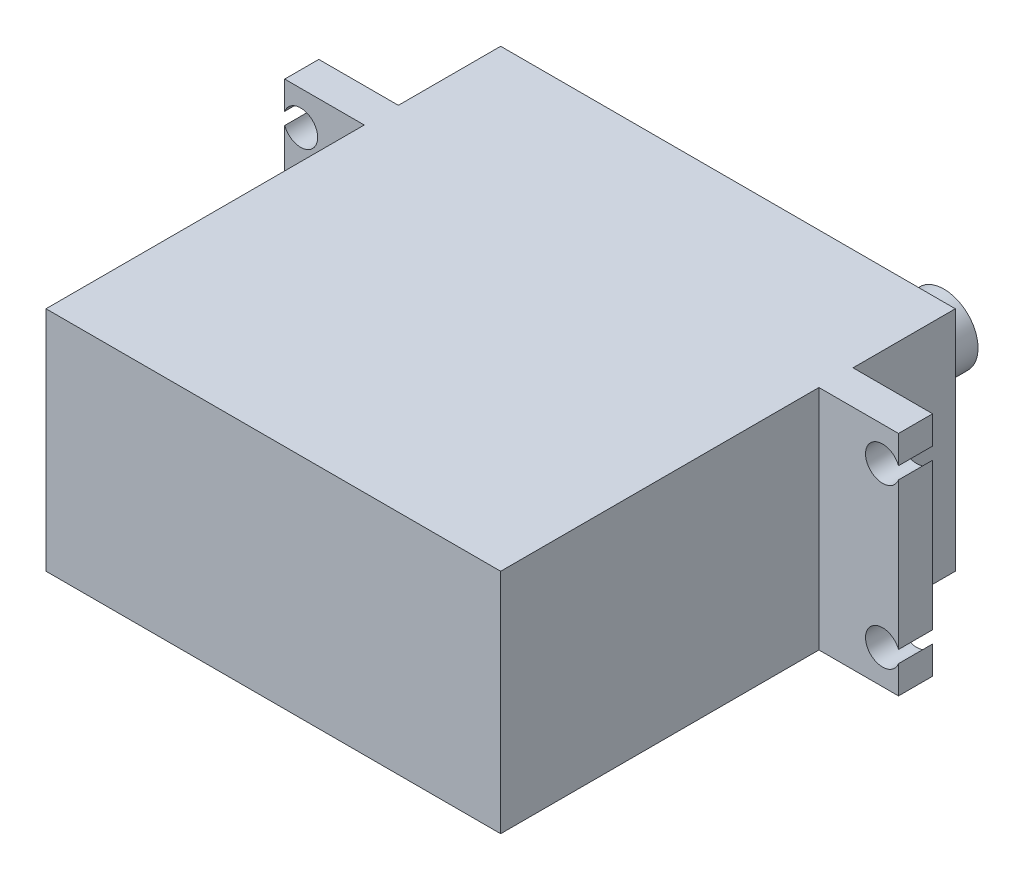
ISO-10303-21;
HEADER;
FILE_DESCRIPTION(('STEP AP214'),'2;1');
FILE_NAME('part.step','',(''),(''),'','','');
FILE_SCHEMA(('AUTOMOTIVE_DESIGN { 1 0 10303 214 1 1 1 1 }'));
ENDSEC;
DATA;
#1=APPLICATION_CONTEXT('core data for automotive mechanical design processes');
#2=APPLICATION_PROTOCOL_DEFINITION('international standard','automotive_design',2000,#1);
#3=PRODUCT_CONTEXT('',#1,'mechanical');
#4=PRODUCT('Part','Part','',(#3));
#5=PRODUCT_RELATED_PRODUCT_CATEGORY('part','',(#4));
#6=PRODUCT_DEFINITION_FORMATION('','',#4);
#7=PRODUCT_DEFINITION_CONTEXT('part definition',#1,'design');
#8=PRODUCT_DEFINITION('design','',#6,#7);
#9=PRODUCT_DEFINITION_SHAPE('','',#8);
#10=(LENGTH_UNIT() NAMED_UNIT(*) SI_UNIT(.MILLI.,.METRE.));
#11=(NAMED_UNIT(*) PLANE_ANGLE_UNIT() SI_UNIT($,.RADIAN.));
#12=(NAMED_UNIT(*) SI_UNIT($,.STERADIAN.) SOLID_ANGLE_UNIT());
#13=UNCERTAINTY_MEASURE_WITH_UNIT(LENGTH_MEASURE(1.E-05),#10,'distance_accuracy_value','');
#14=(GEOMETRIC_REPRESENTATION_CONTEXT(3) GLOBAL_UNCERTAINTY_ASSIGNED_CONTEXT((#13)) GLOBAL_UNIT_ASSIGNED_CONTEXT((#10,
#11,#12)) REPRESENTATION_CONTEXT('',''));
#15=CARTESIAN_POINT('',(0.,0.,0.));
#16=DIRECTION('',(0.,0.,1.));
#17=DIRECTION('',(1.,0.,0.));
#18=AXIS2_PLACEMENT_3D('',#15,#16,#17);
#19=CARTESIAN_POINT('',(47.,0.,0.));
#20=DIRECTION('',(-1.,0.,0.));
#21=DIRECTION('',(0.,0.,1.));
#22=AXIS2_PLACEMENT_3D('',#19,#20,#21);
#23=PLANE('',#22);
#24=DIRECTION('',(0.,-1.,0.));
#25=VECTOR('',#24,1.);
#26=CARTESIAN_POINT('',(47.,20.,12.));
#27=LINE('',#26,#25);
#28=CARTESIAN_POINT('',(47.,16.4614835192865,12.));
#29=VERTEX_POINT('',#28);
#30=CARTESIAN_POINT('',(47.,3.53851648071347,12.));
#31=VERTEX_POINT('',#30);
#32=EDGE_CURVE('E241',#29,#31,#27,.T.);
#33=ORIENTED_EDGE('',*,*,#32,.T.);
#34=DIRECTION('',(0.,0.,-1.));
#35=VECTOR('',#34,1.);
#36=CARTESIAN_POINT('',(47.,3.53851648071347,16.));
#37=LINE('',#36,#35);
#38=CARTESIAN_POINT('',(47.,3.53851648071347,9.));
#39=VERTEX_POINT('',#38);
#40=EDGE_CURVE('E11',#31,#39,#37,.T.);
#41=ORIENTED_EDGE('',*,*,#40,.T.);
#42=DIRECTION('',(0.,1.,0.));
#43=VECTOR('',#42,1.);
#44=CARTESIAN_POINT('',(47.,20.,9.));
#45=LINE('',#44,#43);
#46=CARTESIAN_POINT('',(47.,16.4614835192865,9.));
#47=VERTEX_POINT('',#46);
#48=EDGE_CURVE('E233',#39,#47,#45,.T.);
#49=ORIENTED_EDGE('',*,*,#48,.T.);
#50=DIRECTION('',(0.,0.,-1.));
#51=VECTOR('',#50,1.);
#52=CARTESIAN_POINT('',(47.,16.4614835192865,16.));
#53=LINE('',#52,#51);
#54=EDGE_CURVE('E295',#47,#29,#53,.F.);
#55=ORIENTED_EDGE('',*,*,#54,.T.);
#56=EDGE_LOOP('',(#33,#41,#49,#55));
#57=FACE_BOUND('',#56,.T.);
#58=ADVANCED_FACE('F35',(#57),#23,.F.);
#59=CARTESIAN_POINT('',(-7.,0.,0.));
#60=DIRECTION('',(-1.,0.,0.));
#61=DIRECTION('',(0.,0.,1.));
#62=AXIS2_PLACEMENT_3D('',#59,#60,#61);
#63=PLANE('',#62);
#64=DIRECTION('',(0.,0.,-1.));
#65=VECTOR('',#64,1.);
#66=CARTESIAN_POINT('',(-7.,17.5385164807135,16.));
#67=LINE('',#66,#65);
#68=CARTESIAN_POINT('',(-7.,17.5385164807135,12.));
#69=VERTEX_POINT('',#68);
#70=CARTESIAN_POINT('',(-7.,17.5385164807135,9.));
#71=VERTEX_POINT('',#70);
#72=EDGE_CURVE('E303',#69,#71,#67,.T.);
#73=ORIENTED_EDGE('',*,*,#72,.F.);
#74=DIRECTION('',(0.,1.,0.));
#75=VECTOR('',#74,1.);
#76=CARTESIAN_POINT('',(-7.,20.,12.));
#77=LINE('',#76,#75);
#78=CARTESIAN_POINT('',(-7.,20.,12.));
#79=VERTEX_POINT('',#78);
#80=EDGE_CURVE('E204',#69,#79,#77,.T.);
#81=ORIENTED_EDGE('',*,*,#80,.T.);
#82=DIRECTION('',(0.,0.,-1.));
#83=VECTOR('',#82,1.);
#84=CARTESIAN_POINT('',(-7.,20.,9.));
#85=LINE('',#84,#83);
#86=CARTESIAN_POINT('',(-7.,20.,9.));
#87=VERTEX_POINT('',#86);
#88=EDGE_CURVE('E208',#79,#87,#85,.T.);
#89=ORIENTED_EDGE('',*,*,#88,.T.);
#90=DIRECTION('',(0.,-1.,0.));
#91=VECTOR('',#90,1.);
#92=CARTESIAN_POINT('',(-7.,20.,9.));
#93=LINE('',#92,#91);
#94=EDGE_CURVE('E194',#87,#71,#93,.T.);
#95=ORIENTED_EDGE('',*,*,#94,.T.);
#96=EDGE_LOOP('',(#73,#81,#89,#95));
#97=FACE_BOUND('',#96,.T.);
#98=ADVANCED_FACE('F369',(#97),#63,.T.);
#99=DIRECTION('',(0.,0.,-1.));
#100=VECTOR('',#99,1.);
#101=CARTESIAN_POINT('',(-7.,16.4614835192865,16.));
#102=LINE('',#101,#100);
#103=CARTESIAN_POINT('',(-7.,16.4614835192865,9.));
#104=VERTEX_POINT('',#103);
#105=CARTESIAN_POINT('',(-7.,16.4614835192865,12.));
#106=VERTEX_POINT('',#105);
#107=EDGE_CURVE('E178',#104,#106,#102,.F.);
#108=ORIENTED_EDGE('',*,*,#107,.F.);
#109=CARTESIAN_POINT('',(-7.,3.53851648071344,9.));
#110=VERTEX_POINT('',#109);
#111=EDGE_CURVE('E186',#104,#110,#93,.T.);
#112=ORIENTED_EDGE('',*,*,#111,.T.);
#113=DIRECTION('',(0.,0.,-1.));
#114=VECTOR('',#113,1.);
#115=CARTESIAN_POINT('',(-7.,3.53851648071344,16.));
#116=LINE('',#115,#114);
#117=CARTESIAN_POINT('',(-7.,3.53851648071344,12.));
#118=VERTEX_POINT('',#117);
#119=EDGE_CURVE('E170',#118,#110,#116,.T.);
#120=ORIENTED_EDGE('',*,*,#119,.F.);
#121=EDGE_CURVE('E209',#118,#106,#77,.T.);
#122=ORIENTED_EDGE('',*,*,#121,.T.);
#123=EDGE_LOOP('',(#108,#112,#120,#122));
#124=FACE_BOUND('',#123,.T.);
#125=ADVANCED_FACE('F193',(#124),#63,.T.);
#126=CARTESIAN_POINT('',(47.,20.,12.));
#127=VERTEX_POINT('',#126);
#128=CARTESIAN_POINT('',(47.,17.5385164807135,12.));
#129=VERTEX_POINT('',#128);
#130=EDGE_CURVE('E237',#127,#129,#27,.T.);
#131=ORIENTED_EDGE('',*,*,#130,.T.);
#132=DIRECTION('',(0.,0.,-1.));
#133=VECTOR('',#132,1.);
#134=CARTESIAN_POINT('',(47.,17.5385164807135,16.));
#135=LINE('',#134,#133);
#136=CARTESIAN_POINT('',(47.,17.5385164807135,9.));
#137=VERTEX_POINT('',#136);
#138=EDGE_CURVE('E298',#129,#137,#135,.T.);
#139=ORIENTED_EDGE('',*,*,#138,.T.);
#140=CARTESIAN_POINT('',(47.,20.,9.));
#141=VERTEX_POINT('',#140);
#142=EDGE_CURVE('E234',#137,#141,#45,.T.);
#143=ORIENTED_EDGE('',*,*,#142,.T.);
#144=DIRECTION('',(0.,0.,1.));
#145=VECTOR('',#144,1.);
#146=CARTESIAN_POINT('',(47.,20.,9.));
#147=LINE('',#146,#145);
#148=EDGE_CURVE('E232',#141,#127,#147,.T.);
#149=ORIENTED_EDGE('',*,*,#148,.T.);
#150=EDGE_LOOP('',(#131,#139,#143,#149));
#151=FACE_BOUND('',#150,.T.);
#152=ADVANCED_FACE('F323',(#151),#23,.F.);
#153=CARTESIAN_POINT('',(0.,0.,40.));
#154=DIRECTION('',(1.,0.,0.));
#155=DIRECTION('',(0.,0.,-1.));
#156=AXIS2_PLACEMENT_3D('',#153,#154,#155);
#157=PLANE('',#156);
#158=DIRECTION('',(0.,-1.,0.));
#159=VECTOR('',#158,1.);
#160=CARTESIAN_POINT('',(0.,20.,9.));
#161=LINE('',#160,#159);
#162=CARTESIAN_POINT('',(0.,20.,9.));
#163=VERTEX_POINT('',#162);
#164=CARTESIAN_POINT('',(0.,0.,9.));
#165=VERTEX_POINT('',#164);
#166=EDGE_CURVE('E212',#163,#165,#161,.T.);
#167=ORIENTED_EDGE('',*,*,#166,.F.);
#168=DIRECTION('',(0.,0.,-1.));
#169=VECTOR('',#168,1.);
#170=CARTESIAN_POINT('',(0.,20.,40.));
#171=LINE('',#170,#169);
#172=CARTESIAN_POINT('',(0.,20.,0.));
#173=VERTEX_POINT('',#172);
#174=EDGE_CURVE('E271',#163,#173,#171,.T.);
#175=ORIENTED_EDGE('',*,*,#174,.T.);
#176=DIRECTION('',(0.,-1.,0.));
#177=VECTOR('',#176,1.);
#178=CARTESIAN_POINT('',(0.,0.,0.));
#179=LINE('',#178,#177);
#180=CARTESIAN_POINT('',(0.,0.,0.));
#181=VERTEX_POINT('',#180);
#182=EDGE_CURVE('E260',#173,#181,#179,.T.);
#183=ORIENTED_EDGE('',*,*,#182,.T.);
#184=DIRECTION('',(0.,0.,-1.));
#185=VECTOR('',#184,1.);
#186=CARTESIAN_POINT('',(0.,0.,40.));
#187=LINE('',#186,#185);
#188=EDGE_CURVE('E291',#165,#181,#187,.T.);
#189=ORIENTED_EDGE('',*,*,#188,.F.);
#190=EDGE_LOOP('',(#167,#175,#183,#189));
#191=FACE_BOUND('',#190,.T.);
#192=ADVANCED_FACE('F37',(#191),#157,.F.);
#193=DIRECTION('',(0.,1.,0.));
#194=VECTOR('',#193,1.);
#195=CARTESIAN_POINT('',(0.,20.,12.));
#196=LINE('',#195,#194);
#197=CARTESIAN_POINT('',(0.,0.,12.));
#198=VERTEX_POINT('',#197);
#199=CARTESIAN_POINT('',(0.,20.,12.));
#200=VERTEX_POINT('',#199);
#201=EDGE_CURVE('E198',#198,#200,#196,.T.);
#202=ORIENTED_EDGE('',*,*,#201,.F.);
#203=CARTESIAN_POINT('',(0.,0.,40.));
#204=VERTEX_POINT('',#203);
#205=EDGE_CURVE('E292',#204,#198,#187,.T.);
#206=ORIENTED_EDGE('',*,*,#205,.F.);
#207=DIRECTION('',(0.,-1.,0.));
#208=VECTOR('',#207,1.);
#209=CARTESIAN_POINT('',(0.,0.,40.));
#210=LINE('',#209,#208);
#211=CARTESIAN_POINT('',(0.,20.,40.));
#212=VERTEX_POINT('',#211);
#213=EDGE_CURVE('E261',#212,#204,#210,.T.);
#214=ORIENTED_EDGE('',*,*,#213,.F.);
#215=EDGE_CURVE('E282',#212,#200,#171,.T.);
#216=ORIENTED_EDGE('',*,*,#215,.T.);
#217=EDGE_LOOP('',(#202,#206,#214,#216));
#218=FACE_BOUND('',#217,.T.);
#219=ADVANCED_FACE('F380',(#218),#157,.F.);
#220=CARTESIAN_POINT('',(40.,0.,40.));
#221=DIRECTION('',(-1.,0.,0.));
#222=DIRECTION('',(0.,0.,1.));
#223=AXIS2_PLACEMENT_3D('',#220,#221,#222);
#224=PLANE('',#223);
#225=DIRECTION('',(0.,1.,0.));
#226=VECTOR('',#225,1.);
#227=CARTESIAN_POINT('',(40.,20.,9.));
#228=LINE('',#227,#226);
#229=CARTESIAN_POINT('',(40.,0.,9.));
#230=VERTEX_POINT('',#229);
#231=CARTESIAN_POINT('',(40.,20.,9.));
#232=VERTEX_POINT('',#231);
#233=EDGE_CURVE('E228',#230,#232,#228,.T.);
#234=ORIENTED_EDGE('',*,*,#233,.F.);
#235=DIRECTION('',(0.,0.,-1.));
#236=VECTOR('',#235,1.);
#237=CARTESIAN_POINT('',(40.,0.,40.));
#238=LINE('',#237,#236);
#239=CARTESIAN_POINT('',(40.,0.,0.));
#240=VERTEX_POINT('',#239);
#241=EDGE_CURVE('E288',#230,#240,#238,.T.);
#242=ORIENTED_EDGE('',*,*,#241,.T.);
#243=DIRECTION('',(0.,1.,0.));
#244=VECTOR('',#243,1.);
#245=CARTESIAN_POINT('',(40.,0.,0.));
#246=LINE('',#245,#244);
#247=CARTESIAN_POINT('',(40.,20.,0.));
#248=VERTEX_POINT('',#247);
#249=EDGE_CURVE('E277',#240,#248,#246,.T.);
#250=ORIENTED_EDGE('',*,*,#249,.T.);
#251=DIRECTION('',(0.,0.,-1.));
#252=VECTOR('',#251,1.);
#253=CARTESIAN_POINT('',(40.,20.,40.));
#254=LINE('',#253,#252);
#255=EDGE_CURVE('E284',#232,#248,#254,.T.);
#256=ORIENTED_EDGE('',*,*,#255,.F.);
#257=EDGE_LOOP('',(#234,#242,#250,#256));
#258=FACE_BOUND('',#257,.T.);
#259=ADVANCED_FACE('F359',(#258),#224,.F.);
#260=DIRECTION('',(0.,-1.,0.));
#261=VECTOR('',#260,1.);
#262=CARTESIAN_POINT('',(40.,20.,12.));
#263=LINE('',#262,#261);
#264=CARTESIAN_POINT('',(40.,20.,12.));
#265=VERTEX_POINT('',#264);
#266=CARTESIAN_POINT('',(40.,0.,12.));
#267=VERTEX_POINT('',#266);
#268=EDGE_CURVE('E246',#265,#267,#263,.T.);
#269=ORIENTED_EDGE('',*,*,#268,.F.);
#270=CARTESIAN_POINT('',(40.,20.,40.));
#271=VERTEX_POINT('',#270);
#272=EDGE_CURVE('E285',#271,#265,#254,.T.);
#273=ORIENTED_EDGE('',*,*,#272,.F.);
#274=DIRECTION('',(0.,1.,0.));
#275=VECTOR('',#274,1.);
#276=CARTESIAN_POINT('',(40.,0.,40.));
#277=LINE('',#276,#275);
#278=CARTESIAN_POINT('',(40.,0.,40.));
#279=VERTEX_POINT('',#278);
#280=EDGE_CURVE('E267',#279,#271,#277,.T.);
#281=ORIENTED_EDGE('',*,*,#280,.F.);
#282=EDGE_CURVE('E289',#279,#267,#238,.T.);
#283=ORIENTED_EDGE('',*,*,#282,.T.);
#284=EDGE_LOOP('',(#269,#273,#281,#283));
#285=FACE_BOUND('',#284,.T.);
#286=ADVANCED_FACE('F384',(#285),#224,.F.);
#287=CARTESIAN_POINT('',(0.,0.,40.));
#288=DIRECTION('',(0.,1.,0.));
#289=DIRECTION('',(0.,0.,1.));
#290=AXIS2_PLACEMENT_3D('',#287,#288,#289);
#291=PLANE('',#290);
#292=DIRECTION('',(1.,0.,0.));
#293=VECTOR('',#292,1.);
#294=CARTESIAN_POINT('',(0.,0.,0.));
#295=LINE('',#294,#293);
#296=EDGE_CURVE('E274',#181,#240,#295,.T.);
#297=ORIENTED_EDGE('',*,*,#296,.T.);
#298=ORIENTED_EDGE('',*,*,#241,.F.);
#299=DIRECTION('',(-1.,0.,0.));
#300=VECTOR('',#299,1.);
#301=CARTESIAN_POINT('',(47.,0.,9.));
#302=LINE('',#301,#300);
#303=CARTESIAN_POINT('',(47.,0.,9.));
#304=VERTEX_POINT('',#303);
#305=EDGE_CURVE('E243',#304,#230,#302,.T.);
#306=ORIENTED_EDGE('',*,*,#305,.F.);
#307=DIRECTION('',(0.,0.,-1.));
#308=VECTOR('',#307,1.);
#309=CARTESIAN_POINT('',(47.,0.,9.));
#310=LINE('',#309,#308);
#311=CARTESIAN_POINT('',(47.,0.,12.));
#312=VERTEX_POINT('',#311);
#313=EDGE_CURVE('E240',#312,#304,#310,.T.);
#314=ORIENTED_EDGE('',*,*,#313,.F.);
#315=DIRECTION('',(-1.,0.,0.));
#316=VECTOR('',#315,1.);
#317=CARTESIAN_POINT('',(47.,0.,12.));
#318=LINE('',#317,#316);
#319=EDGE_CURVE('E251',#312,#267,#318,.T.);
#320=ORIENTED_EDGE('',*,*,#319,.T.);
#321=ORIENTED_EDGE('',*,*,#282,.F.);
#322=DIRECTION('',(1.,0.,0.));
#323=VECTOR('',#322,1.);
#324=CARTESIAN_POINT('',(0.,0.,40.));
#325=LINE('',#324,#323);
#326=EDGE_CURVE('E264',#204,#279,#325,.T.);
#327=ORIENTED_EDGE('',*,*,#326,.F.);
#328=ORIENTED_EDGE('',*,*,#205,.T.);
#329=DIRECTION('',(1.,0.,0.));
#330=VECTOR('',#329,1.);
#331=CARTESIAN_POINT('',(-7.,0.,12.));
#332=LINE('',#331,#330);
#333=CARTESIAN_POINT('',(-7.,0.,12.));
#334=VERTEX_POINT('',#333);
#335=EDGE_CURVE('E222',#334,#198,#332,.T.);
#336=ORIENTED_EDGE('',*,*,#335,.F.);
#337=DIRECTION('',(0.,0.,1.));
#338=VECTOR('',#337,1.);
#339=CARTESIAN_POINT('',(-7.,0.,9.));
#340=LINE('',#339,#338);
#341=CARTESIAN_POINT('',(-7.,0.,9.));
#342=VERTEX_POINT('',#341);
#343=EDGE_CURVE('E197',#342,#334,#340,.T.);
#344=ORIENTED_EDGE('',*,*,#343,.F.);
#345=DIRECTION('',(1.,0.,0.));
#346=VECTOR('',#345,1.);
#347=CARTESIAN_POINT('',(-7.,0.,9.));
#348=LINE('',#347,#346);
#349=EDGE_CURVE('E225',#342,#165,#348,.T.);
#350=ORIENTED_EDGE('',*,*,#349,.T.);
#351=ORIENTED_EDGE('',*,*,#188,.T.);
#352=EDGE_LOOP('',(#297,#298,#306,#314,#320,#321,#327,#328,#336,#344,#350,#351));
#353=FACE_BOUND('',#352,.T.);
#354=ADVANCED_FACE('F335',(#353),#291,.F.);
#355=CARTESIAN_POINT('',(0.,20.,40.));
#356=DIRECTION('',(0.,-1.,0.));
#357=DIRECTION('',(0.,0.,-1.));
#358=AXIS2_PLACEMENT_3D('',#355,#356,#357);
#359=PLANE('',#358);
#360=DIRECTION('',(-1.,0.,0.));
#361=VECTOR('',#360,1.);
#362=CARTESIAN_POINT('',(0.,20.,0.));
#363=LINE('',#362,#361);
#364=EDGE_CURVE('E265',#248,#173,#363,.T.);
#365=ORIENTED_EDGE('',*,*,#364,.T.);
#366=ORIENTED_EDGE('',*,*,#174,.F.);
#367=DIRECTION('',(1.,0.,0.));
#368=VECTOR('',#367,1.);
#369=CARTESIAN_POINT('',(-7.,20.,9.));
#370=LINE('',#369,#368);
#371=EDGE_CURVE('E211',#87,#163,#370,.T.);
#372=ORIENTED_EDGE('',*,*,#371,.F.);
#373=ORIENTED_EDGE('',*,*,#88,.F.);
#374=DIRECTION('',(1.,0.,0.));
#375=VECTOR('',#374,1.);
#376=CARTESIAN_POINT('',(-7.,20.,12.));
#377=LINE('',#376,#375);
#378=EDGE_CURVE('E219',#79,#200,#377,.T.);
#379=ORIENTED_EDGE('',*,*,#378,.T.);
#380=ORIENTED_EDGE('',*,*,#215,.F.);
#381=DIRECTION('',(-1.,0.,0.));
#382=VECTOR('',#381,1.);
#383=CARTESIAN_POINT('',(0.,20.,40.));
#384=LINE('',#383,#382);
#385=EDGE_CURVE('E269',#271,#212,#384,.T.);
#386=ORIENTED_EDGE('',*,*,#385,.F.);
#387=ORIENTED_EDGE('',*,*,#272,.T.);
#388=DIRECTION('',(-1.,0.,0.));
#389=VECTOR('',#388,1.);
#390=CARTESIAN_POINT('',(47.,20.,12.));
#391=LINE('',#390,#389);
#392=EDGE_CURVE('E254',#127,#265,#391,.T.);
#393=ORIENTED_EDGE('',*,*,#392,.F.);
#394=ORIENTED_EDGE('',*,*,#148,.F.);
#395=DIRECTION('',(-1.,0.,0.));
#396=VECTOR('',#395,1.);
#397=CARTESIAN_POINT('',(47.,20.,9.));
#398=LINE('',#397,#396);
#399=EDGE_CURVE('E257',#141,#232,#398,.T.);
#400=ORIENTED_EDGE('',*,*,#399,.T.);
#401=ORIENTED_EDGE('',*,*,#255,.T.);
#402=EDGE_LOOP('',(#365,#366,#372,#373,#379,#380,#386,#387,#393,#394,#400,#401));
#403=FACE_BOUND('',#402,.T.);
#404=ADVANCED_FACE('F329',(#403),#359,.F.);
#405=CARTESIAN_POINT('',(0.,0.,40.));
#406=DIRECTION('',(0.,0.,-1.));
#407=DIRECTION('',(-1.,0.,0.));
#408=AXIS2_PLACEMENT_3D('',#405,#406,#407);
#409=PLANE('',#408);
#410=ORIENTED_EDGE('',*,*,#213,.T.);
#411=ORIENTED_EDGE('',*,*,#326,.T.);
#412=ORIENTED_EDGE('',*,*,#280,.T.);
#413=ORIENTED_EDGE('',*,*,#385,.T.);
#414=EDGE_LOOP('',(#410,#411,#412,#413));
#415=FACE_BOUND('',#414,.T.);
#416=ADVANCED_FACE('F383',(#415),#409,.F.);
#417=CARTESIAN_POINT('',(0.,0.,0.));
#418=DIRECTION('',(0.,0.,-1.));
#419=DIRECTION('',(-1.,0.,0.));
#420=AXIS2_PLACEMENT_3D('',#417,#418,#419);
#421=PLANE('',#420);
#422=CARTESIAN_POINT('',(31.,10.,0.));
#423=DIRECTION('',(0.,0.,-1.));
#424=DIRECTION('',(-1.,0.,0.));
#425=AXIS2_PLACEMENT_3D('',#422,#423,#424);
#426=CIRCLE('',#425,3.);
#427=CARTESIAN_POINT('',(28.,10.,0.));
#428=VERTEX_POINT('',#427);
#429=EDGE_CURVE('E348',#428,#428,#426,.T.);
#430=ORIENTED_EDGE('',*,*,#429,.F.);
#431=EDGE_LOOP('',(#430));
#432=FACE_BOUND('',#431,.T.);
#433=ORIENTED_EDGE('',*,*,#182,.F.);
#434=ORIENTED_EDGE('',*,*,#364,.F.);
#435=ORIENTED_EDGE('',*,*,#249,.F.);
#436=ORIENTED_EDGE('',*,*,#296,.F.);
#437=EDGE_LOOP('',(#433,#434,#435,#436));
#438=FACE_BOUND('',#437,.T.);
#439=ADVANCED_FACE('F362',(#432,#438),#421,.T.);
#440=CARTESIAN_POINT('',(47.,20.,9.));
#441=DIRECTION('',(0.,0.,1.));
#442=DIRECTION('',(0.,-1.,0.));
#443=AXIS2_PLACEMENT_3D('',#440,#441,#442);
#444=PLANE('',#443);
#445=ORIENTED_EDGE('',*,*,#48,.F.);
#446=CARTESIAN_POINT('',(45.6,3.,9.));
#447=DIRECTION('',(0.,0.,-1.));
#448=DIRECTION('',(0.,1.,0.));
#449=AXIS2_PLACEMENT_3D('',#446,#447,#448);
#450=CIRCLE('',#449,1.5);
#451=CARTESIAN_POINT('',(47.,2.46148351928653,9.));
#452=VERTEX_POINT('',#451);
#453=EDGE_CURVE('E341',#452,#39,#450,.T.);
#454=ORIENTED_EDGE('',*,*,#453,.F.);
#455=EDGE_CURVE('E229',#304,#452,#45,.T.);
#456=ORIENTED_EDGE('',*,*,#455,.F.);
#457=ORIENTED_EDGE('',*,*,#305,.T.);
#458=ORIENTED_EDGE('',*,*,#233,.T.);
#459=ORIENTED_EDGE('',*,*,#399,.F.);
#460=ORIENTED_EDGE('',*,*,#142,.F.);
#461=CARTESIAN_POINT('',(45.6,17.,9.));
#462=DIRECTION('',(0.,0.,-1.));
#463=DIRECTION('',(0.,1.,0.));
#464=AXIS2_PLACEMENT_3D('',#461,#462,#463);
#465=CIRCLE('',#464,1.5);
#466=EDGE_CURVE('E321',#47,#137,#465,.T.);
#467=ORIENTED_EDGE('',*,*,#466,.F.);
#468=EDGE_LOOP('',(#445,#454,#456,#457,#458,#459,#460,#467));
#469=FACE_BOUND('',#468,.T.);
#470=ADVANCED_FACE('F340',(#469),#444,.F.);
#471=CARTESIAN_POINT('',(47.,20.,12.));
#472=DIRECTION('',(0.,0.,-1.));
#473=DIRECTION('',(0.,1.,0.));
#474=AXIS2_PLACEMENT_3D('',#471,#472,#473);
#475=PLANE('',#474);
#476=CARTESIAN_POINT('',(47.,2.46148351928653,12.));
#477=VERTEX_POINT('',#476);
#478=EDGE_CURVE('E236',#477,#312,#27,.T.);
#479=ORIENTED_EDGE('',*,*,#478,.F.);
#480=CARTESIAN_POINT('',(45.6,3.,12.));
#481=DIRECTION('',(0.,0.,-1.));
#482=DIRECTION('',(0.,1.,0.));
#483=AXIS2_PLACEMENT_3D('',#480,#481,#482);
#484=CIRCLE('',#483,1.5);
#485=EDGE_CURVE('E50',#477,#31,#484,.T.);
#486=ORIENTED_EDGE('',*,*,#485,.T.);
#487=ORIENTED_EDGE('',*,*,#32,.F.);
#488=CARTESIAN_POINT('',(45.6,17.,12.));
#489=DIRECTION('',(0.,0.,-1.));
#490=DIRECTION('',(0.,1.,0.));
#491=AXIS2_PLACEMENT_3D('',#488,#489,#490);
#492=CIRCLE('',#491,1.5);
#493=EDGE_CURVE('E201',#29,#129,#492,.T.);
#494=ORIENTED_EDGE('',*,*,#493,.T.);
#495=ORIENTED_EDGE('',*,*,#130,.F.);
#496=ORIENTED_EDGE('',*,*,#392,.T.);
#497=ORIENTED_EDGE('',*,*,#268,.T.);
#498=ORIENTED_EDGE('',*,*,#319,.F.);
#499=EDGE_LOOP('',(#479,#486,#487,#494,#495,#496,#497,#498));
#500=FACE_BOUND('',#499,.T.);
#501=ADVANCED_FACE('F311',(#500),#475,.F.);
#502=ORIENTED_EDGE('',*,*,#455,.T.);
#503=DIRECTION('',(0.,0.,-1.));
#504=VECTOR('',#503,1.);
#505=CARTESIAN_POINT('',(47.,2.46148351928653,16.));
#506=LINE('',#505,#504);
#507=EDGE_CURVE('E43',#452,#477,#506,.F.);
#508=ORIENTED_EDGE('',*,*,#507,.T.);
#509=ORIENTED_EDGE('',*,*,#478,.T.);
#510=ORIENTED_EDGE('',*,*,#313,.T.);
#511=EDGE_LOOP('',(#502,#508,#509,#510));
#512=FACE_BOUND('',#511,.T.);
#513=ADVANCED_FACE('F306',(#512),#23,.F.);
#514=CARTESIAN_POINT('',(-7.,20.,9.));
#515=DIRECTION('',(0.,0.,1.));
#516=DIRECTION('',(1.,0.,0.));
#517=AXIS2_PLACEMENT_3D('',#514,#515,#516);
#518=PLANE('',#517);
#519=ORIENTED_EDGE('',*,*,#111,.F.);
#520=CARTESIAN_POINT('',(-5.6,17.,9.));
#521=DIRECTION('',(0.,0.,-1.));
#522=DIRECTION('',(0.,1.,0.));
#523=AXIS2_PLACEMENT_3D('',#520,#521,#522);
#524=CIRCLE('',#523,1.5);
#525=EDGE_CURVE('E189',#71,#104,#524,.T.);
#526=ORIENTED_EDGE('',*,*,#525,.F.);
#527=ORIENTED_EDGE('',*,*,#94,.F.);
#528=ORIENTED_EDGE('',*,*,#371,.T.);
#529=ORIENTED_EDGE('',*,*,#166,.T.);
#530=ORIENTED_EDGE('',*,*,#349,.F.);
#531=CARTESIAN_POINT('',(-7.,2.46148351928655,9.));
#532=VERTEX_POINT('',#531);
#533=EDGE_CURVE('E188',#532,#342,#93,.T.);
#534=ORIENTED_EDGE('',*,*,#533,.F.);
#535=CARTESIAN_POINT('',(-5.6,3.,9.));
#536=DIRECTION('',(0.,0.,-1.));
#537=DIRECTION('',(0.,1.,0.));
#538=AXIS2_PLACEMENT_3D('',#535,#536,#537);
#539=CIRCLE('',#538,1.5);
#540=EDGE_CURVE('E58',#110,#532,#539,.T.);
#541=ORIENTED_EDGE('',*,*,#540,.F.);
#542=EDGE_LOOP('',(#519,#526,#527,#528,#529,#530,#534,#541));
#543=FACE_BOUND('',#542,.T.);
#544=ADVANCED_FACE('F184',(#543),#518,.F.);
#545=CARTESIAN_POINT('',(-7.,20.,12.));
#546=DIRECTION('',(0.,0.,-1.));
#547=DIRECTION('',(0.,1.,0.));
#548=AXIS2_PLACEMENT_3D('',#545,#546,#547);
#549=PLANE('',#548);
#550=ORIENTED_EDGE('',*,*,#80,.F.);
#551=CARTESIAN_POINT('',(-5.6,17.,12.));
#552=DIRECTION('',(0.,0.,-1.));
#553=DIRECTION('',(0.,1.,0.));
#554=AXIS2_PLACEMENT_3D('',#551,#552,#553);
#555=CIRCLE('',#554,1.5);
#556=EDGE_CURVE('E344',#69,#106,#555,.T.);
#557=ORIENTED_EDGE('',*,*,#556,.T.);
#558=ORIENTED_EDGE('',*,*,#121,.F.);
#559=CARTESIAN_POINT('',(-5.6,3.,12.));
#560=DIRECTION('',(0.,0.,-1.));
#561=DIRECTION('',(0.,1.,0.));
#562=AXIS2_PLACEMENT_3D('',#559,#560,#561);
#563=CIRCLE('',#562,1.5);
#564=CARTESIAN_POINT('',(-7.,2.46148351928655,12.));
#565=VERTEX_POINT('',#564);
#566=EDGE_CURVE('E173',#118,#565,#563,.T.);
#567=ORIENTED_EDGE('',*,*,#566,.T.);
#568=EDGE_CURVE('E205',#334,#565,#77,.T.);
#569=ORIENTED_EDGE('',*,*,#568,.F.);
#570=ORIENTED_EDGE('',*,*,#335,.T.);
#571=ORIENTED_EDGE('',*,*,#201,.T.);
#572=ORIENTED_EDGE('',*,*,#378,.F.);
#573=EDGE_LOOP('',(#550,#557,#558,#567,#569,#570,#571,#572));
#574=FACE_BOUND('',#573,.T.);
#575=ADVANCED_FACE('F375',(#574),#549,.F.);
#576=DIRECTION('',(0.,0.,-1.));
#577=VECTOR('',#576,1.);
#578=CARTESIAN_POINT('',(-7.,2.46148351928655,16.));
#579=LINE('',#578,#577);
#580=EDGE_CURVE('E179',#532,#565,#579,.F.);
#581=ORIENTED_EDGE('',*,*,#580,.F.);
#582=ORIENTED_EDGE('',*,*,#533,.T.);
#583=ORIENTED_EDGE('',*,*,#343,.T.);
#584=ORIENTED_EDGE('',*,*,#568,.T.);
#585=EDGE_LOOP('',(#581,#582,#583,#584));
#586=FACE_BOUND('',#585,.T.);
#587=ADVANCED_FACE('F398',(#586),#63,.T.);
#588=CARTESIAN_POINT('',(45.6,17.,16.));
#589=DIRECTION('',(0.,0.,-1.));
#590=DIRECTION('',(0.,1.,0.));
#591=AXIS2_PLACEMENT_3D('',#588,#589,#590);
#592=CYLINDRICAL_SURFACE('',#591,1.5);
#593=ORIENTED_EDGE('',*,*,#493,.F.);
#594=ORIENTED_EDGE('',*,*,#54,.F.);
#595=ORIENTED_EDGE('',*,*,#466,.T.);
#596=ORIENTED_EDGE('',*,*,#138,.F.);
#597=EDGE_LOOP('',(#593,#594,#595,#596));
#598=FACE_BOUND('',#597,.T.);
#599=ADVANCED_FACE('F353',(#598),#592,.F.);
#600=CARTESIAN_POINT('',(-5.6,3.,16.));
#601=DIRECTION('',(0.,0.,-1.));
#602=DIRECTION('',(0.,1.,0.));
#603=AXIS2_PLACEMENT_3D('',#600,#601,#602);
#604=CYLINDRICAL_SURFACE('',#603,1.5);
#605=ORIENTED_EDGE('',*,*,#119,.T.);
#606=ORIENTED_EDGE('',*,*,#540,.T.);
#607=ORIENTED_EDGE('',*,*,#580,.T.);
#608=ORIENTED_EDGE('',*,*,#566,.F.);
#609=EDGE_LOOP('',(#605,#606,#607,#608));
#610=FACE_BOUND('',#609,.T.);
#611=ADVANCED_FACE('F171',(#610),#604,.F.);
#612=CARTESIAN_POINT('',(-5.6,17.,16.));
#613=DIRECTION('',(0.,0.,-1.));
#614=DIRECTION('',(0.,1.,0.));
#615=AXIS2_PLACEMENT_3D('',#612,#613,#614);
#616=CYLINDRICAL_SURFACE('',#615,1.5);
#617=ORIENTED_EDGE('',*,*,#72,.T.);
#618=ORIENTED_EDGE('',*,*,#525,.T.);
#619=ORIENTED_EDGE('',*,*,#107,.T.);
#620=ORIENTED_EDGE('',*,*,#556,.F.);
#621=EDGE_LOOP('',(#617,#618,#619,#620));
#622=FACE_BOUND('',#621,.T.);
#623=ADVANCED_FACE('F490',(#622),#616,.F.);
#624=CARTESIAN_POINT('',(45.6,3.,16.));
#625=DIRECTION('',(0.,0.,-1.));
#626=DIRECTION('',(0.,1.,0.));
#627=AXIS2_PLACEMENT_3D('',#624,#625,#626);
#628=CYLINDRICAL_SURFACE('',#627,1.5);
#629=ORIENTED_EDGE('',*,*,#485,.F.);
#630=ORIENTED_EDGE('',*,*,#507,.F.);
#631=ORIENTED_EDGE('',*,*,#453,.T.);
#632=ORIENTED_EDGE('',*,*,#40,.F.);
#633=EDGE_LOOP('',(#629,#630,#631,#632));
#634=FACE_BOUND('',#633,.T.);
#635=ADVANCED_FACE('F498',(#634),#628,.F.);
#636=CARTESIAN_POINT('',(31.,10.,-8.));
#637=DIRECTION('',(0.,0.,1.));
#638=DIRECTION('',(1.,0.,0.));
#639=AXIS2_PLACEMENT_3D('',#636,#637,#638);
#640=CYLINDRICAL_SURFACE('',#639,3.);
#641=CARTESIAN_POINT('',(31.,10.,-8.));
#642=DIRECTION('',(0.,0.,-1.));
#643=DIRECTION('',(-1.,0.,0.));
#644=AXIS2_PLACEMENT_3D('',#641,#642,#643);
#645=CIRCLE('',#644,3.);
#646=CARTESIAN_POINT('',(28.,10.,-8.));
#647=VERTEX_POINT('',#646);
#648=EDGE_CURVE('E190',#647,#647,#645,.T.);
#649=ORIENTED_EDGE('',*,*,#648,.F.);
#650=EDGE_LOOP('',(#649));
#651=FACE_BOUND('',#650,.T.);
#652=ORIENTED_EDGE('',*,*,#429,.T.);
#653=EDGE_LOOP('',(#652));
#654=FACE_BOUND('',#653,.T.);
#655=ADVANCED_FACE('F507',(#651,#654),#640,.T.);
#656=CARTESIAN_POINT('',(31.,10.,-8.));
#657=DIRECTION('',(0.,0.,-1.));
#658=DIRECTION('',(-1.,0.,0.));
#659=AXIS2_PLACEMENT_3D('',#656,#657,#658);
#660=PLANE('',#659);
#661=ORIENTED_EDGE('',*,*,#648,.T.);
#662=EDGE_LOOP('',(#661));
#663=FACE_BOUND('',#662,.T.);
#664=ADVANCED_FACE('F516',(#663),#660,.T.);
#665=CLOSED_SHELL('',(#58,#98,#125,#152,#192,#219,#259,#286,#354,#404,#416,#439,#470,#501,#513,
#544,#575,#587,#599,#611,#623,#635,#655,#664));
#666=MANIFOLD_SOLID_BREP('B2',#665);
#667=ADVANCED_BREP_SHAPE_REPRESENTATION('',(#18,#666),#14);
#668=SHAPE_DEFINITION_REPRESENTATION(#9,#667);
ENDSEC;
END-ISO-10303-21;
